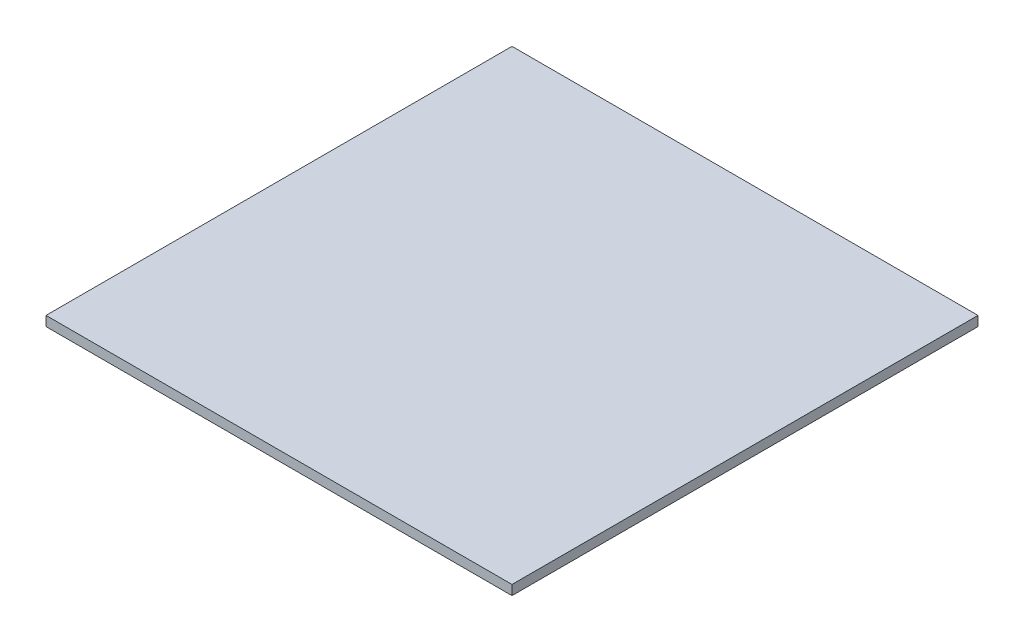
ISO-10303-21;
HEADER;
FILE_DESCRIPTION(('STEP AP214'),'2;1');
FILE_NAME('part.step','',(''),(''),'','','');
FILE_SCHEMA(('AUTOMOTIVE_DESIGN { 1 0 10303 214 1 1 1 1 }'));
ENDSEC;
DATA;
#1=APPLICATION_CONTEXT('core data for automotive mechanical design processes');
#2=APPLICATION_PROTOCOL_DEFINITION('international standard','automotive_design',2000,#1);
#3=PRODUCT_CONTEXT('',#1,'mechanical');
#4=PRODUCT('Part','Part','',(#3));
#5=PRODUCT_RELATED_PRODUCT_CATEGORY('part','',(#4));
#6=PRODUCT_DEFINITION_FORMATION('','',#4);
#7=PRODUCT_DEFINITION_CONTEXT('part definition',#1,'design');
#8=PRODUCT_DEFINITION('design','',#6,#7);
#9=PRODUCT_DEFINITION_SHAPE('','',#8);
#10=(LENGTH_UNIT() NAMED_UNIT(*) SI_UNIT(.MILLI.,.METRE.));
#11=(NAMED_UNIT(*) PLANE_ANGLE_UNIT() SI_UNIT($,.RADIAN.));
#12=(NAMED_UNIT(*) SI_UNIT($,.STERADIAN.) SOLID_ANGLE_UNIT());
#13=UNCERTAINTY_MEASURE_WITH_UNIT(LENGTH_MEASURE(1.E-05),#10,'distance_accuracy_value','');
#14=(GEOMETRIC_REPRESENTATION_CONTEXT(3) GLOBAL_UNCERTAINTY_ASSIGNED_CONTEXT((#13)) GLOBAL_UNIT_ASSIGNED_CONTEXT((#10,
#11,#12)) REPRESENTATION_CONTEXT('',''));
#15=CARTESIAN_POINT('',(0.,0.,0.));
#16=DIRECTION('',(0.,0.,1.));
#17=DIRECTION('',(1.,0.,0.));
#18=AXIS2_PLACEMENT_3D('',#15,#16,#17);
#19=CARTESIAN_POINT('',(0.,3.175,0.));
#20=DIRECTION('',(1.,0.,0.));
#21=DIRECTION('',(0.,0.,-1.));
#22=AXIS2_PLACEMENT_3D('',#19,#20,#21);
#23=PLANE('',#22);
#24=DIRECTION('',(0.,0.,1.));
#25=VECTOR('',#24,1.);
#26=CARTESIAN_POINT('',(0.,0.,0.));
#27=LINE('',#26,#25);
#28=CARTESIAN_POINT('',(0.,0.,-152.4));
#29=VERTEX_POINT('',#28);
#30=CARTESIAN_POINT('',(0.,0.,0.));
#31=VERTEX_POINT('',#30);
#32=EDGE_CURVE('E96',#29,#31,#27,.T.);
#33=ORIENTED_EDGE('',*,*,#32,.T.);
#34=DIRECTION('',(0.,-1.,0.));
#35=VECTOR('',#34,1.);
#36=CARTESIAN_POINT('',(0.,3.175,0.));
#37=LINE('',#36,#35);
#38=CARTESIAN_POINT('',(0.,3.175,0.));
#39=VERTEX_POINT('',#38);
#40=EDGE_CURVE('E11',#39,#31,#37,.T.);
#41=ORIENTED_EDGE('',*,*,#40,.F.);
#42=DIRECTION('',(0.,0.,1.));
#43=VECTOR('',#42,1.);
#44=CARTESIAN_POINT('',(0.,3.175,0.));
#45=LINE('',#44,#43);
#46=CARTESIAN_POINT('',(0.,3.175,-152.4));
#47=VERTEX_POINT('',#46);
#48=EDGE_CURVE('E84',#47,#39,#45,.T.);
#49=ORIENTED_EDGE('',*,*,#48,.F.);
#50=DIRECTION('',(0.,-1.,0.));
#51=VECTOR('',#50,1.);
#52=CARTESIAN_POINT('',(0.,3.175,-152.4));
#53=LINE('',#52,#51);
#54=EDGE_CURVE('E92',#47,#29,#53,.T.);
#55=ORIENTED_EDGE('',*,*,#54,.T.);
#56=EDGE_LOOP('',(#33,#41,#49,#55));
#57=FACE_BOUND('',#56,.T.);
#58=ADVANCED_FACE('F33',(#57),#23,.F.);
#59=CARTESIAN_POINT('',(0.,3.175,0.));
#60=DIRECTION('',(0.,0.,-1.));
#61=DIRECTION('',(-1.,0.,0.));
#62=AXIS2_PLACEMENT_3D('',#59,#60,#61);
#63=PLANE('',#62);
#64=DIRECTION('',(1.,0.,0.));
#65=VECTOR('',#64,1.);
#66=CARTESIAN_POINT('',(0.,0.,0.));
#67=LINE('',#66,#65);
#68=CARTESIAN_POINT('',(152.4,0.,0.));
#69=VERTEX_POINT('',#68);
#70=EDGE_CURVE('E88',#31,#69,#67,.T.);
#71=ORIENTED_EDGE('',*,*,#70,.T.);
#72=DIRECTION('',(0.,-1.,0.));
#73=VECTOR('',#72,1.);
#74=CARTESIAN_POINT('',(152.4,3.175,0.));
#75=LINE('',#74,#73);
#76=CARTESIAN_POINT('',(152.4,3.175,0.));
#77=VERTEX_POINT('',#76);
#78=EDGE_CURVE('E41',#77,#69,#75,.T.);
#79=ORIENTED_EDGE('',*,*,#78,.F.);
#80=DIRECTION('',(1.,0.,0.));
#81=VECTOR('',#80,1.);
#82=CARTESIAN_POINT('',(0.,3.175,0.));
#83=LINE('',#82,#81);
#84=EDGE_CURVE('E79',#39,#77,#83,.T.);
#85=ORIENTED_EDGE('',*,*,#84,.F.);
#86=ORIENTED_EDGE('',*,*,#40,.T.);
#87=EDGE_LOOP('',(#71,#79,#85,#86));
#88=FACE_BOUND('',#87,.T.);
#89=ADVANCED_FACE('F87',(#88),#63,.F.);
#90=CARTESIAN_POINT('',(152.4,3.175,0.));
#91=DIRECTION('',(-1.,0.,0.));
#92=DIRECTION('',(0.,0.,1.));
#93=AXIS2_PLACEMENT_3D('',#90,#91,#92);
#94=PLANE('',#93);
#95=DIRECTION('',(0.,0.,-1.));
#96=VECTOR('',#95,1.);
#97=CARTESIAN_POINT('',(152.4,0.,0.));
#98=LINE('',#97,#96);
#99=CARTESIAN_POINT('',(152.4,0.,-152.4));
#100=VERTEX_POINT('',#99);
#101=EDGE_CURVE('E66',#69,#100,#98,.T.);
#102=ORIENTED_EDGE('',*,*,#101,.T.);
#103=DIRECTION('',(0.,-1.,0.));
#104=VECTOR('',#103,1.);
#105=CARTESIAN_POINT('',(152.4,3.175,-152.4));
#106=LINE('',#105,#104);
#107=CARTESIAN_POINT('',(152.4,3.175,-152.4));
#108=VERTEX_POINT('',#107);
#109=EDGE_CURVE('E89',#108,#100,#106,.T.);
#110=ORIENTED_EDGE('',*,*,#109,.F.);
#111=DIRECTION('',(0.,0.,-1.));
#112=VECTOR('',#111,1.);
#113=CARTESIAN_POINT('',(152.4,3.175,0.));
#114=LINE('',#113,#112);
#115=EDGE_CURVE('E82',#77,#108,#114,.T.);
#116=ORIENTED_EDGE('',*,*,#115,.F.);
#117=ORIENTED_EDGE('',*,*,#78,.T.);
#118=EDGE_LOOP('',(#102,#110,#116,#117));
#119=FACE_BOUND('',#118,.T.);
#120=ADVANCED_FACE('F90',(#119),#94,.F.);
#121=CARTESIAN_POINT('',(0.,3.175,-152.4));
#122=DIRECTION('',(0.,0.,1.));
#123=DIRECTION('',(1.,0.,0.));
#124=AXIS2_PLACEMENT_3D('',#121,#122,#123);
#125=PLANE('',#124);
#126=DIRECTION('',(-1.,0.,0.));
#127=VECTOR('',#126,1.);
#128=CARTESIAN_POINT('',(0.,0.,-152.4));
#129=LINE('',#128,#127);
#130=EDGE_CURVE('E72',#100,#29,#129,.T.);
#131=ORIENTED_EDGE('',*,*,#130,.T.);
#132=ORIENTED_EDGE('',*,*,#54,.F.);
#133=DIRECTION('',(-1.,0.,0.));
#134=VECTOR('',#133,1.);
#135=CARTESIAN_POINT('',(0.,3.175,-152.4));
#136=LINE('',#135,#134);
#137=EDGE_CURVE('E49',#108,#47,#136,.T.);
#138=ORIENTED_EDGE('',*,*,#137,.F.);
#139=ORIENTED_EDGE('',*,*,#109,.T.);
#140=EDGE_LOOP('',(#131,#132,#138,#139));
#141=FACE_BOUND('',#140,.T.);
#142=ADVANCED_FACE('F103',(#141),#125,.F.);
#143=CARTESIAN_POINT('',(0.,3.175,0.));
#144=DIRECTION('',(0.,-1.,0.));
#145=DIRECTION('',(0.,0.,-1.));
#146=AXIS2_PLACEMENT_3D('',#143,#144,#145);
#147=PLANE('',#146);
#148=ORIENTED_EDGE('',*,*,#48,.T.);
#149=ORIENTED_EDGE('',*,*,#84,.T.);
#150=ORIENTED_EDGE('',*,*,#115,.T.);
#151=ORIENTED_EDGE('',*,*,#137,.T.);
#152=EDGE_LOOP('',(#148,#149,#150,#151));
#153=FACE_BOUND('',#152,.T.);
#154=ADVANCED_FACE('F80',(#153),#147,.F.);
#155=CARTESIAN_POINT('',(0.,0.,0.));
#156=DIRECTION('',(0.,-1.,0.));
#157=DIRECTION('',(0.,0.,-1.));
#158=AXIS2_PLACEMENT_3D('',#155,#156,#157);
#159=PLANE('',#158);
#160=ORIENTED_EDGE('',*,*,#32,.F.);
#161=ORIENTED_EDGE('',*,*,#130,.F.);
#162=ORIENTED_EDGE('',*,*,#101,.F.);
#163=ORIENTED_EDGE('',*,*,#70,.F.);
#164=EDGE_LOOP('',(#160,#161,#162,#163));
#165=FACE_BOUND('',#164,.T.);
#166=ADVANCED_FACE('F106',(#165),#159,.T.);
#167=CLOSED_SHELL('',(#58,#89,#120,#142,#154,#166));
#168=MANIFOLD_SOLID_BREP('B2',#167);
#169=ADVANCED_BREP_SHAPE_REPRESENTATION('',(#18,#168),#14);
#170=SHAPE_DEFINITION_REPRESENTATION(#9,#169);
ENDSEC;
END-ISO-10303-21;
